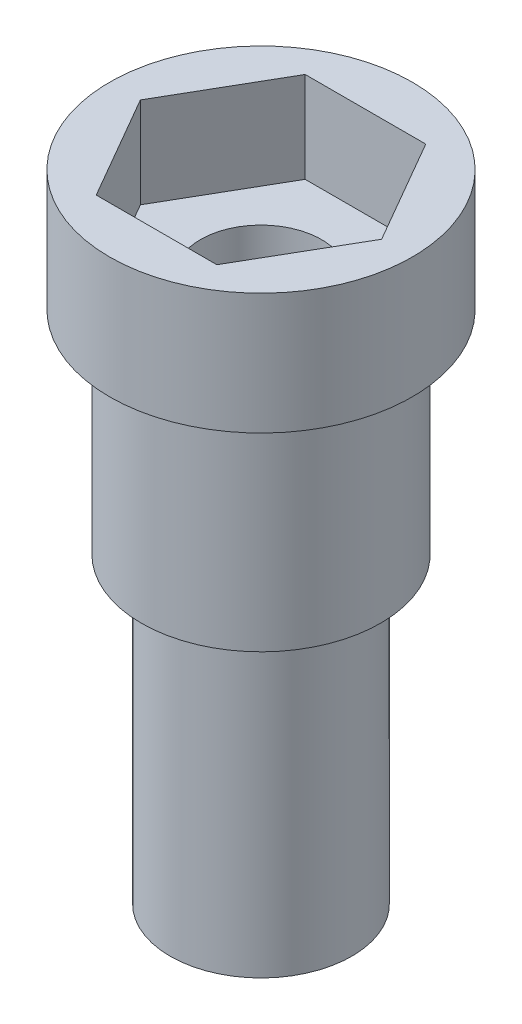
ISO-10303-21;
HEADER;
FILE_DESCRIPTION(('STEP AP214'),'2;1');
FILE_NAME('part.step','',(''),(''),'','','');
FILE_SCHEMA(('AUTOMOTIVE_DESIGN { 1 0 10303 214 1 1 1 1 }'));
ENDSEC;
DATA;
#1=APPLICATION_CONTEXT('core data for automotive mechanical design processes');
#2=APPLICATION_PROTOCOL_DEFINITION('international standard','automotive_design',2000,#1);
#3=PRODUCT_CONTEXT('',#1,'mechanical');
#4=PRODUCT('Part','Part','',(#3));
#5=PRODUCT_RELATED_PRODUCT_CATEGORY('part','',(#4));
#6=PRODUCT_DEFINITION_FORMATION('','',#4);
#7=PRODUCT_DEFINITION_CONTEXT('part definition',#1,'design');
#8=PRODUCT_DEFINITION('design','',#6,#7);
#9=PRODUCT_DEFINITION_SHAPE('','',#8);
#10=(LENGTH_UNIT() NAMED_UNIT(*) SI_UNIT(.MILLI.,.METRE.));
#11=(NAMED_UNIT(*) PLANE_ANGLE_UNIT() SI_UNIT($,.RADIAN.));
#12=(NAMED_UNIT(*) SI_UNIT($,.STERADIAN.) SOLID_ANGLE_UNIT());
#13=UNCERTAINTY_MEASURE_WITH_UNIT(LENGTH_MEASURE(1.E-05),#10,'distance_accuracy_value','');
#14=(GEOMETRIC_REPRESENTATION_CONTEXT(3) GLOBAL_UNCERTAINTY_ASSIGNED_CONTEXT((#13)) GLOBAL_UNIT_ASSIGNED_CONTEXT((#10,
#11,#12)) REPRESENTATION_CONTEXT('',''));
#15=CARTESIAN_POINT('',(0.,0.,0.));
#16=DIRECTION('',(0.,0.,1.));
#17=DIRECTION('',(1.,0.,0.));
#18=AXIS2_PLACEMENT_3D('',#15,#16,#17);
#19=CARTESIAN_POINT('',(0.,18.,0.));
#20=DIRECTION('',(0.,-1.,0.));
#21=DIRECTION('',(0.,0.,-1.));
#22=AXIS2_PLACEMENT_3D('',#19,#20,#21);
#23=CYLINDRICAL_SURFACE('',#22,2.);
#24=CARTESIAN_POINT('',(0.,0.,0.));
#25=DIRECTION('',(0.,1.,0.));
#26=DIRECTION('',(0.,0.,1.));
#27=AXIS2_PLACEMENT_3D('',#24,#25,#26);
#28=CIRCLE('',#27,2.);
#29=CARTESIAN_POINT('',(0.,0.,2.));
#30=VERTEX_POINT('',#29);
#31=EDGE_CURVE('E158',#30,#30,#28,.T.);
#32=ORIENTED_EDGE('',*,*,#31,.F.);
#33=EDGE_LOOP('',(#32));
#34=FACE_BOUND('',#33,.T.);
#35=CARTESIAN_POINT('',(0.,18.,0.));
#36=DIRECTION('',(0.,1.,0.));
#37=DIRECTION('',(0.,0.,1.));
#38=AXIS2_PLACEMENT_3D('',#35,#36,#37);
#39=CIRCLE('',#38,2.);
#40=CARTESIAN_POINT('',(0.,18.,2.));
#41=VERTEX_POINT('',#40);
#42=EDGE_CURVE('E43',#41,#41,#39,.T.);
#43=ORIENTED_EDGE('',*,*,#42,.T.);
#44=EDGE_LOOP('',(#43));
#45=FACE_BOUND('',#44,.T.);
#46=ADVANCED_FACE('F39',(#34,#45),#23,.F.);
#47=CARTESIAN_POINT('',(0.,18.,0.));
#48=DIRECTION('',(0.,-1.,0.));
#49=DIRECTION('',(0.,0.,-1.));
#50=AXIS2_PLACEMENT_3D('',#47,#48,#49);
#51=CYLINDRICAL_SURFACE('',#50,3.);
#52=CARTESIAN_POINT('',(0.,0.,0.));
#53=DIRECTION('',(0.,1.,0.));
#54=DIRECTION('',(0.,0.,1.));
#55=AXIS2_PLACEMENT_3D('',#52,#53,#54);
#56=CIRCLE('',#55,3.);
#57=CARTESIAN_POINT('',(0.,0.,3.));
#58=VERTEX_POINT('',#57);
#59=EDGE_CURVE('E48',#58,#58,#56,.T.);
#60=ORIENTED_EDGE('',*,*,#59,.T.);
#61=EDGE_LOOP('',(#60));
#62=FACE_BOUND('',#61,.T.);
#63=CARTESIAN_POINT('',(0.,10.,0.));
#64=DIRECTION('',(0.,1.,0.));
#65=DIRECTION('',(0.,0.,1.));
#66=AXIS2_PLACEMENT_3D('',#63,#64,#65);
#67=CIRCLE('',#66,3.);
#68=CARTESIAN_POINT('',(0.,10.,3.));
#69=VERTEX_POINT('',#68);
#70=EDGE_CURVE('E11',#69,#69,#67,.T.);
#71=ORIENTED_EDGE('',*,*,#70,.F.);
#72=EDGE_LOOP('',(#71));
#73=FACE_BOUND('',#72,.T.);
#74=ADVANCED_FACE('F41',(#62,#73),#51,.T.);
#75=CARTESIAN_POINT('',(0.,0.,0.));
#76=DIRECTION('',(0.,1.,0.));
#77=DIRECTION('',(0.,0.,1.));
#78=AXIS2_PLACEMENT_3D('',#75,#76,#77);
#79=PLANE('',#78);
#80=ORIENTED_EDGE('',*,*,#59,.F.);
#81=EDGE_LOOP('',(#80));
#82=FACE_BOUND('',#81,.T.);
#83=ORIENTED_EDGE('',*,*,#31,.T.);
#84=EDGE_LOOP('',(#83));
#85=FACE_BOUND('',#84,.T.);
#86=ADVANCED_FACE('F167',(#82,#85),#79,.F.);
#87=CARTESIAN_POINT('',(0.,10.,0.));
#88=DIRECTION('',(0.,1.,0.));
#89=DIRECTION('',(0.,0.,1.));
#90=AXIS2_PLACEMENT_3D('',#87,#88,#89);
#91=PLANE('',#90);
#92=CARTESIAN_POINT('',(0.,10.,0.));
#93=DIRECTION('',(0.,1.,0.));
#94=DIRECTION('',(0.,0.,1.));
#95=AXIS2_PLACEMENT_3D('',#92,#93,#94);
#96=CIRCLE('',#95,3.95);
#97=CARTESIAN_POINT('',(0.,10.,3.95));
#98=VERTEX_POINT('',#97);
#99=EDGE_CURVE('E151',#98,#98,#96,.T.);
#100=ORIENTED_EDGE('',*,*,#99,.F.);
#101=EDGE_LOOP('',(#100));
#102=FACE_BOUND('',#101,.T.);
#103=ORIENTED_EDGE('',*,*,#70,.T.);
#104=EDGE_LOOP('',(#103));
#105=FACE_BOUND('',#104,.T.);
#106=ADVANCED_FACE('F170',(#102,#105),#91,.F.);
#107=CARTESIAN_POINT('',(0.,17.,0.));
#108=DIRECTION('',(0.,-1.,0.));
#109=DIRECTION('',(0.,0.,-1.));
#110=AXIS2_PLACEMENT_3D('',#107,#108,#109);
#111=CYLINDRICAL_SURFACE('',#110,3.95);
#112=CARTESIAN_POINT('',(0.,17.,0.));
#113=DIRECTION('',(0.,1.,0.));
#114=DIRECTION('',(0.,0.,1.));
#115=AXIS2_PLACEMENT_3D('',#112,#113,#114);
#116=CIRCLE('',#115,3.95);
#117=CARTESIAN_POINT('',(0.,17.,3.95));
#118=VERTEX_POINT('',#117);
#119=EDGE_CURVE('E155',#118,#118,#116,.T.);
#120=ORIENTED_EDGE('',*,*,#119,.F.);
#121=EDGE_LOOP('',(#120));
#122=FACE_BOUND('',#121,.T.);
#123=ORIENTED_EDGE('',*,*,#99,.T.);
#124=EDGE_LOOP('',(#123));
#125=FACE_BOUND('',#124,.T.);
#126=ADVANCED_FACE('F207',(#122,#125),#111,.T.);
#127=CARTESIAN_POINT('',(0.,21.,0.));
#128=DIRECTION('',(0.,1.,0.));
#129=DIRECTION('',(0.,0.,1.));
#130=AXIS2_PLACEMENT_3D('',#127,#128,#129);
#131=PLANE('',#130);
#132=DIRECTION('',(0.5,0.,-0.866025403784439));
#133=VECTOR('',#132,1.);
#134=CARTESIAN_POINT('',(1.99185842870421,21.,3.45));
#135=LINE('',#134,#133);
#136=CARTESIAN_POINT('',(1.99185842870421,21.,3.45));
#137=VERTEX_POINT('',#136);
#138=CARTESIAN_POINT('',(3.98371685740842,21.,0.));
#139=VERTEX_POINT('',#138);
#140=EDGE_CURVE('E56',#137,#139,#135,.T.);
#141=ORIENTED_EDGE('',*,*,#140,.F.);
#142=DIRECTION('',(1.,0.,0.));
#143=VECTOR('',#142,1.);
#144=CARTESIAN_POINT('',(-1.99185842870421,21.,3.45));
#145=LINE('',#144,#143);
#146=CARTESIAN_POINT('',(-1.99185842870421,21.,3.45));
#147=VERTEX_POINT('',#146);
#148=EDGE_CURVE('E139',#147,#137,#145,.T.);
#149=ORIENTED_EDGE('',*,*,#148,.F.);
#150=DIRECTION('',(0.5,0.,0.866025403784439));
#151=VECTOR('',#150,1.);
#152=CARTESIAN_POINT('',(-3.98371685740842,21.,0.));
#153=LINE('',#152,#151);
#154=CARTESIAN_POINT('',(-3.98371685740842,21.,0.));
#155=VERTEX_POINT('',#154);
#156=EDGE_CURVE('E137',#155,#147,#153,.T.);
#157=ORIENTED_EDGE('',*,*,#156,.F.);
#158=DIRECTION('',(-0.5,0.,0.866025403784439));
#159=VECTOR('',#158,1.);
#160=CARTESIAN_POINT('',(-1.99185842870421,21.,-3.45));
#161=LINE('',#160,#159);
#162=CARTESIAN_POINT('',(-1.99185842870421,21.,-3.45));
#163=VERTEX_POINT('',#162);
#164=EDGE_CURVE('E104',#163,#155,#161,.T.);
#165=ORIENTED_EDGE('',*,*,#164,.F.);
#166=DIRECTION('',(-1.,0.,0.));
#167=VECTOR('',#166,1.);
#168=CARTESIAN_POINT('',(1.99185842870421,21.,-3.45));
#169=LINE('',#168,#167);
#170=CARTESIAN_POINT('',(1.99185842870421,21.,-3.45));
#171=VERTEX_POINT('',#170);
#172=EDGE_CURVE('E133',#171,#163,#169,.T.);
#173=ORIENTED_EDGE('',*,*,#172,.F.);
#174=DIRECTION('',(-0.5,0.,-0.866025403784439));
#175=VECTOR('',#174,1.);
#176=CARTESIAN_POINT('',(3.98371685740842,21.,0.));
#177=LINE('',#176,#175);
#178=EDGE_CURVE('E130',#139,#171,#177,.T.);
#179=ORIENTED_EDGE('',*,*,#178,.F.);
#180=EDGE_LOOP('',(#141,#149,#157,#165,#173,#179));
#181=FACE_BOUND('',#180,.T.);
#182=CARTESIAN_POINT('',(0.,21.,0.));
#183=DIRECTION('',(0.,1.,0.));
#184=DIRECTION('',(0.,0.,1.));
#185=AXIS2_PLACEMENT_3D('',#182,#183,#184);
#186=CIRCLE('',#185,5.);
#187=CARTESIAN_POINT('',(0.,21.,5.));
#188=VERTEX_POINT('',#187);
#189=EDGE_CURVE('E148',#188,#188,#186,.T.);
#190=ORIENTED_EDGE('',*,*,#189,.T.);
#191=EDGE_LOOP('',(#190));
#192=FACE_BOUND('',#191,.T.);
#193=ADVANCED_FACE('F203',(#181,#192),#131,.T.);
#194=CARTESIAN_POINT('',(0.,17.,0.));
#195=DIRECTION('',(0.,1.,0.));
#196=DIRECTION('',(0.,0.,1.));
#197=AXIS2_PLACEMENT_3D('',#194,#195,#196);
#198=PLANE('',#197);
#199=ORIENTED_EDGE('',*,*,#119,.T.);
#200=EDGE_LOOP('',(#199));
#201=FACE_BOUND('',#200,.T.);
#202=CARTESIAN_POINT('',(0.,17.,0.));
#203=DIRECTION('',(0.,1.,0.));
#204=DIRECTION('',(0.,0.,1.));
#205=AXIS2_PLACEMENT_3D('',#202,#203,#204);
#206=CIRCLE('',#205,5.);
#207=CARTESIAN_POINT('',(0.,17.,5.));
#208=VERTEX_POINT('',#207);
#209=EDGE_CURVE('E152',#208,#208,#206,.T.);
#210=ORIENTED_EDGE('',*,*,#209,.F.);
#211=EDGE_LOOP('',(#210));
#212=FACE_BOUND('',#211,.T.);
#213=ADVANCED_FACE('F206',(#201,#212),#198,.F.);
#214=CARTESIAN_POINT('',(0.,21.,0.));
#215=DIRECTION('',(0.,-1.,0.));
#216=DIRECTION('',(0.,0.,-1.));
#217=AXIS2_PLACEMENT_3D('',#214,#215,#216);
#218=CYLINDRICAL_SURFACE('',#217,5.);
#219=ORIENTED_EDGE('',*,*,#189,.F.);
#220=EDGE_LOOP('',(#219));
#221=FACE_BOUND('',#220,.T.);
#222=ORIENTED_EDGE('',*,*,#209,.T.);
#223=EDGE_LOOP('',(#222));
#224=FACE_BOUND('',#223,.T.);
#225=ADVANCED_FACE('F202',(#221,#224),#218,.T.);
#226=CARTESIAN_POINT('',(1.99185842870421,18.,3.45));
#227=DIRECTION('',(0.866025403784439,0.,0.5));
#228=DIRECTION('',(0.5,0.,-0.866025403784439));
#229=AXIS2_PLACEMENT_3D('',#226,#227,#228);
#230=PLANE('',#229);
#231=ORIENTED_EDGE('',*,*,#140,.T.);
#232=DIRECTION('',(0.,1.,0.));
#233=VECTOR('',#232,1.);
#234=CARTESIAN_POINT('',(3.98371685740842,18.,0.));
#235=LINE('',#234,#233);
#236=CARTESIAN_POINT('',(3.98371685740842,18.,0.));
#237=VERTEX_POINT('',#236);
#238=EDGE_CURVE('E86',#237,#139,#235,.T.);
#239=ORIENTED_EDGE('',*,*,#238,.F.);
#240=DIRECTION('',(0.5,0.,-0.866025403784439));
#241=VECTOR('',#240,1.);
#242=CARTESIAN_POINT('',(1.99185842870421,18.,3.45));
#243=LINE('',#242,#241);
#244=CARTESIAN_POINT('',(1.99185842870421,18.,3.45));
#245=VERTEX_POINT('',#244);
#246=EDGE_CURVE('E141',#245,#237,#243,.T.);
#247=ORIENTED_EDGE('',*,*,#246,.F.);
#248=DIRECTION('',(0.,1.,0.));
#249=VECTOR('',#248,1.);
#250=CARTESIAN_POINT('',(1.99185842870421,18.,3.45));
#251=LINE('',#250,#249);
#252=EDGE_CURVE('E64',#245,#137,#251,.T.);
#253=ORIENTED_EDGE('',*,*,#252,.T.);
#254=EDGE_LOOP('',(#231,#239,#247,#253));
#255=FACE_BOUND('',#254,.T.);
#256=ADVANCED_FACE('F192',(#255),#230,.F.);
#257=CARTESIAN_POINT('',(-1.99185842870421,18.,3.45));
#258=DIRECTION('',(0.,0.,1.));
#259=DIRECTION('',(1.,0.,0.));
#260=AXIS2_PLACEMENT_3D('',#257,#258,#259);
#261=PLANE('',#260);
#262=ORIENTED_EDGE('',*,*,#148,.T.);
#263=ORIENTED_EDGE('',*,*,#252,.F.);
#264=DIRECTION('',(1.,0.,0.));
#265=VECTOR('',#264,1.);
#266=CARTESIAN_POINT('',(-1.99185842870421,18.,3.45));
#267=LINE('',#266,#265);
#268=CARTESIAN_POINT('',(-1.99185842870421,18.,3.45));
#269=VERTEX_POINT('',#268);
#270=EDGE_CURVE('E116',#269,#245,#267,.T.);
#271=ORIENTED_EDGE('',*,*,#270,.F.);
#272=DIRECTION('',(0.,1.,0.));
#273=VECTOR('',#272,1.);
#274=CARTESIAN_POINT('',(-1.99185842870421,18.,3.45));
#275=LINE('',#274,#273);
#276=EDGE_CURVE('E108',#269,#147,#275,.T.);
#277=ORIENTED_EDGE('',*,*,#276,.T.);
#278=EDGE_LOOP('',(#262,#263,#271,#277));
#279=FACE_BOUND('',#278,.T.);
#280=ADVANCED_FACE('F189',(#279),#261,.F.);
#281=CARTESIAN_POINT('',(-3.98371685740842,18.,0.));
#282=DIRECTION('',(-0.866025403784439,0.,0.5));
#283=DIRECTION('',(0.5,0.,0.866025403784439));
#284=AXIS2_PLACEMENT_3D('',#281,#282,#283);
#285=PLANE('',#284);
#286=ORIENTED_EDGE('',*,*,#156,.T.);
#287=ORIENTED_EDGE('',*,*,#276,.F.);
#288=DIRECTION('',(0.5,0.,0.866025403784439));
#289=VECTOR('',#288,1.);
#290=CARTESIAN_POINT('',(-3.98371685740842,18.,0.));
#291=LINE('',#290,#289);
#292=CARTESIAN_POINT('',(-3.98371685740842,18.,0.));
#293=VERTEX_POINT('',#292);
#294=EDGE_CURVE('E112',#293,#269,#291,.T.);
#295=ORIENTED_EDGE('',*,*,#294,.F.);
#296=DIRECTION('',(0.,1.,0.));
#297=VECTOR('',#296,1.);
#298=CARTESIAN_POINT('',(-3.98371685740842,18.,0.));
#299=LINE('',#298,#297);
#300=EDGE_CURVE('E97',#293,#155,#299,.T.);
#301=ORIENTED_EDGE('',*,*,#300,.T.);
#302=EDGE_LOOP('',(#286,#287,#295,#301));
#303=FACE_BOUND('',#302,.T.);
#304=ADVANCED_FACE('F113',(#303),#285,.F.);
#305=CARTESIAN_POINT('',(-1.99185842870421,18.,-3.45));
#306=DIRECTION('',(-0.866025403784439,0.,-0.5));
#307=DIRECTION('',(-0.5,0.,0.866025403784439));
#308=AXIS2_PLACEMENT_3D('',#305,#306,#307);
#309=PLANE('',#308);
#310=ORIENTED_EDGE('',*,*,#164,.T.);
#311=ORIENTED_EDGE('',*,*,#300,.F.);
#312=DIRECTION('',(-0.5,0.,0.866025403784439));
#313=VECTOR('',#312,1.);
#314=CARTESIAN_POINT('',(-1.99185842870421,18.,-3.45));
#315=LINE('',#314,#313);
#316=CARTESIAN_POINT('',(-1.99185842870421,18.,-3.45));
#317=VERTEX_POINT('',#316);
#318=EDGE_CURVE('E101',#317,#293,#315,.T.);
#319=ORIENTED_EDGE('',*,*,#318,.F.);
#320=DIRECTION('',(0.,1.,0.));
#321=VECTOR('',#320,1.);
#322=CARTESIAN_POINT('',(-1.99185842870421,18.,-3.45));
#323=LINE('',#322,#321);
#324=EDGE_CURVE('E109',#317,#163,#323,.T.);
#325=ORIENTED_EDGE('',*,*,#324,.T.);
#326=EDGE_LOOP('',(#310,#311,#319,#325));
#327=FACE_BOUND('',#326,.T.);
#328=ADVANCED_FACE('F99',(#327),#309,.F.);
#329=CARTESIAN_POINT('',(1.99185842870421,18.,-3.45));
#330=DIRECTION('',(0.,0.,-1.));
#331=DIRECTION('',(-1.,0.,0.));
#332=AXIS2_PLACEMENT_3D('',#329,#330,#331);
#333=PLANE('',#332);
#334=ORIENTED_EDGE('',*,*,#172,.T.);
#335=ORIENTED_EDGE('',*,*,#324,.F.);
#336=DIRECTION('',(-1.,0.,0.));
#337=VECTOR('',#336,1.);
#338=CARTESIAN_POINT('',(1.99185842870421,18.,-3.45));
#339=LINE('',#338,#337);
#340=CARTESIAN_POINT('',(1.99185842870421,18.,-3.45));
#341=VERTEX_POINT('',#340);
#342=EDGE_CURVE('E122',#341,#317,#339,.T.);
#343=ORIENTED_EDGE('',*,*,#342,.F.);
#344=DIRECTION('',(0.,1.,0.));
#345=VECTOR('',#344,1.);
#346=CARTESIAN_POINT('',(1.99185842870421,18.,-3.45));
#347=LINE('',#346,#345);
#348=EDGE_CURVE('E145',#341,#171,#347,.T.);
#349=ORIENTED_EDGE('',*,*,#348,.T.);
#350=EDGE_LOOP('',(#334,#335,#343,#349));
#351=FACE_BOUND('',#350,.T.);
#352=ADVANCED_FACE('F185',(#351),#333,.F.);
#353=CARTESIAN_POINT('',(3.98371685740842,18.,0.));
#354=DIRECTION('',(0.866025403784439,0.,-0.5));
#355=DIRECTION('',(-0.5,0.,-0.866025403784439));
#356=AXIS2_PLACEMENT_3D('',#353,#354,#355);
#357=PLANE('',#356);
#358=ORIENTED_EDGE('',*,*,#178,.T.);
#359=ORIENTED_EDGE('',*,*,#348,.F.);
#360=DIRECTION('',(-0.5,0.,-0.866025403784439));
#361=VECTOR('',#360,1.);
#362=CARTESIAN_POINT('',(3.98371685740842,18.,0.));
#363=LINE('',#362,#361);
#364=EDGE_CURVE('E124',#237,#341,#363,.T.);
#365=ORIENTED_EDGE('',*,*,#364,.F.);
#366=ORIENTED_EDGE('',*,*,#238,.T.);
#367=EDGE_LOOP('',(#358,#359,#365,#366));
#368=FACE_BOUND('',#367,.T.);
#369=ADVANCED_FACE('F180',(#368),#357,.F.);
#370=CARTESIAN_POINT('',(0.,18.,0.));
#371=DIRECTION('',(0.,1.,0.));
#372=DIRECTION('',(0.,0.,1.));
#373=AXIS2_PLACEMENT_3D('',#370,#371,#372);
#374=PLANE('',#373);
#375=ORIENTED_EDGE('',*,*,#42,.F.);
#376=EDGE_LOOP('',(#375));
#377=FACE_BOUND('',#376,.T.);
#378=ORIENTED_EDGE('',*,*,#246,.T.);
#379=ORIENTED_EDGE('',*,*,#364,.T.);
#380=ORIENTED_EDGE('',*,*,#342,.T.);
#381=ORIENTED_EDGE('',*,*,#318,.T.);
#382=ORIENTED_EDGE('',*,*,#294,.T.);
#383=ORIENTED_EDGE('',*,*,#270,.T.);
#384=EDGE_LOOP('',(#378,#379,#380,#381,#382,#383));
#385=FACE_BOUND('',#384,.T.);
#386=ADVANCED_FACE('F119',(#377,#385),#374,.T.);
#387=CLOSED_SHELL('',(#46,#74,#86,#106,#126,#193,#213,#225,#256,#280,#304,#328,#352,#369,#386));
#388=MANIFOLD_SOLID_BREP('B2',#387);
#389=ADVANCED_BREP_SHAPE_REPRESENTATION('',(#18,#388),#14);
#390=SHAPE_DEFINITION_REPRESENTATION(#9,#389);
ENDSEC;
END-ISO-10303-21;
